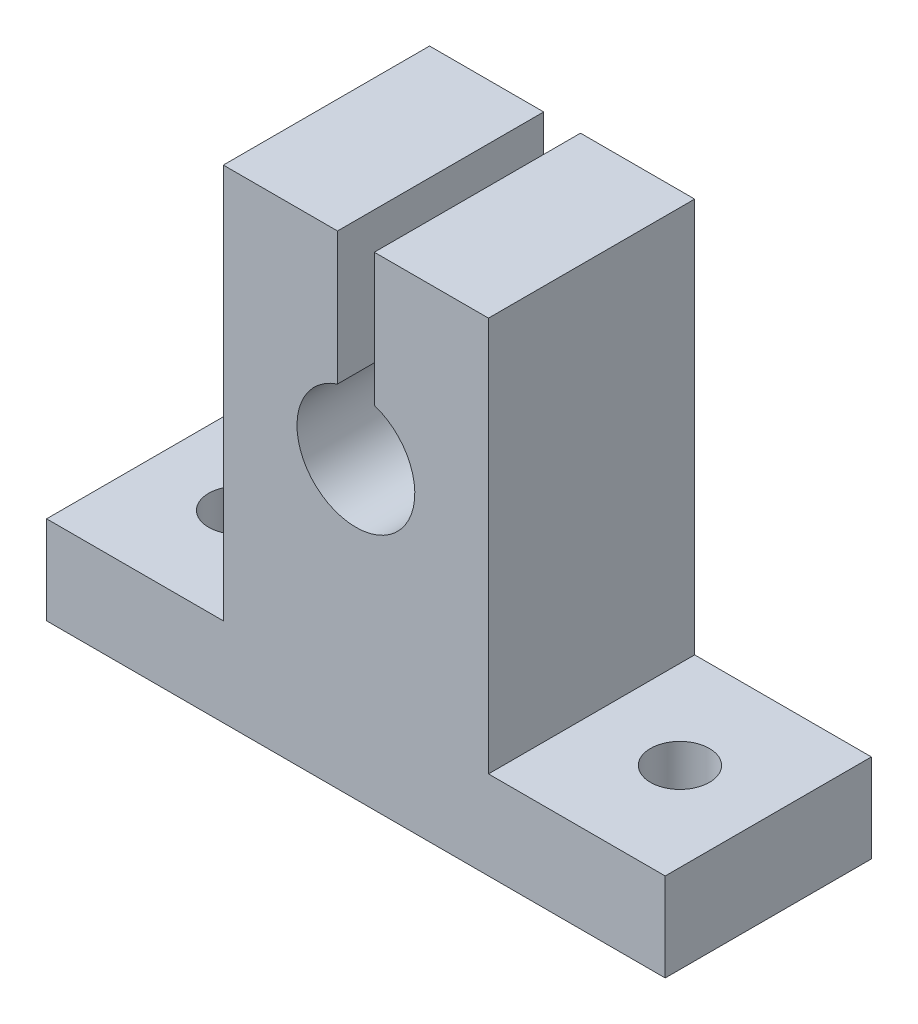
ISO-10303-21;
HEADER;
FILE_DESCRIPTION(('STEP AP214'),'2;1');
FILE_NAME('part.step','',(''),(''),'','','');
FILE_SCHEMA(('AUTOMOTIVE_DESIGN { 1 0 10303 214 1 1 1 1 }'));
ENDSEC;
DATA;
#1=APPLICATION_CONTEXT('core data for automotive mechanical design processes');
#2=APPLICATION_PROTOCOL_DEFINITION('international standard','automotive_design',2000,#1);
#3=PRODUCT_CONTEXT('',#1,'mechanical');
#4=PRODUCT('Part','Part','',(#3));
#5=PRODUCT_RELATED_PRODUCT_CATEGORY('part','',(#4));
#6=PRODUCT_DEFINITION_FORMATION('','',#4);
#7=PRODUCT_DEFINITION_CONTEXT('part definition',#1,'design');
#8=PRODUCT_DEFINITION('design','',#6,#7);
#9=PRODUCT_DEFINITION_SHAPE('','',#8);
#10=(LENGTH_UNIT() NAMED_UNIT(*) SI_UNIT(.MILLI.,.METRE.));
#11=(NAMED_UNIT(*) PLANE_ANGLE_UNIT() SI_UNIT($,.RADIAN.));
#12=(NAMED_UNIT(*) SI_UNIT($,.STERADIAN.) SOLID_ANGLE_UNIT());
#13=UNCERTAINTY_MEASURE_WITH_UNIT(LENGTH_MEASURE(1.E-05),#10,'distance_accuracy_value','');
#14=(GEOMETRIC_REPRESENTATION_CONTEXT(3) GLOBAL_UNCERTAINTY_ASSIGNED_CONTEXT((#13)) GLOBAL_UNIT_ASSIGNED_CONTEXT((#10,
#11,#12)) REPRESENTATION_CONTEXT('',''));
#15=CARTESIAN_POINT('',(0.,0.,0.));
#16=DIRECTION('',(0.,0.,1.));
#17=DIRECTION('',(1.,0.,0.));
#18=AXIS2_PLACEMENT_3D('',#15,#16,#17);
#19=CARTESIAN_POINT('',(0.,6.00000000000001,14.));
#20=DIRECTION('',(1.,0.,0.));
#21=DIRECTION('',(0.,1.,0.));
#22=AXIS2_PLACEMENT_3D('',#19,#20,#21);
#23=PLANE('',#22);
#24=DIRECTION('',(0.,-1.,0.));
#25=VECTOR('',#24,1.);
#26=CARTESIAN_POINT('',(0.,6.00000000000001,0.));
#27=LINE('',#26,#25);
#28=CARTESIAN_POINT('',(0.,6.00000000000001,0.));
#29=VERTEX_POINT('',#28);
#30=CARTESIAN_POINT('',(0.,0.,0.));
#31=VERTEX_POINT('',#30);
#32=EDGE_CURVE('E166',#29,#31,#27,.T.);
#33=ORIENTED_EDGE('',*,*,#32,.T.);
#34=DIRECTION('',(0.,0.,-1.));
#35=VECTOR('',#34,1.);
#36=CARTESIAN_POINT('',(0.,0.,14.));
#37=LINE('',#36,#35);
#38=CARTESIAN_POINT('',(0.,0.,14.));
#39=VERTEX_POINT('',#38);
#40=EDGE_CURVE('E11',#39,#31,#37,.T.);
#41=ORIENTED_EDGE('',*,*,#40,.F.);
#42=DIRECTION('',(0.,-1.,0.));
#43=VECTOR('',#42,1.);
#44=CARTESIAN_POINT('',(0.,6.00000000000001,14.));
#45=LINE('',#44,#43);
#46=CARTESIAN_POINT('',(0.,6.00000000000001,14.));
#47=VERTEX_POINT('',#46);
#48=EDGE_CURVE('E201',#47,#39,#45,.T.);
#49=ORIENTED_EDGE('',*,*,#48,.F.);
#50=DIRECTION('',(0.,0.,-1.));
#51=VECTOR('',#50,1.);
#52=CARTESIAN_POINT('',(0.,6.00000000000001,14.));
#53=LINE('',#52,#51);
#54=EDGE_CURVE('E162',#47,#29,#53,.T.);
#55=ORIENTED_EDGE('',*,*,#54,.T.);
#56=EDGE_LOOP('',(#33,#41,#49,#55));
#57=FACE_BOUND('',#56,.T.);
#58=ADVANCED_FACE('F40',(#57),#23,.F.);
#59=CARTESIAN_POINT('',(0.,0.,14.));
#60=DIRECTION('',(0.,1.,0.));
#61=DIRECTION('',(0.,0.,1.));
#62=AXIS2_PLACEMENT_3D('',#59,#60,#61);
#63=PLANE('',#62);
#64=CARTESIAN_POINT('',(6.00000000000001,0.,7.00000000000001));
#65=DIRECTION('',(0.,1.,0.));
#66=DIRECTION('',(-1.,0.,0.));
#67=AXIS2_PLACEMENT_3D('',#64,#65,#66);
#68=CIRCLE('',#67,2.);
#69=CARTESIAN_POINT('',(4.00000000000001,0.,7.00000000000001));
#70=VERTEX_POINT('',#69);
#71=EDGE_CURVE('E171',#70,#70,#68,.T.);
#72=ORIENTED_EDGE('',*,*,#71,.T.);
#73=EDGE_LOOP('',(#72));
#74=FACE_BOUND('',#73,.T.);
#75=CARTESIAN_POINT('',(36.,0.,7.00000000000001));
#76=DIRECTION('',(0.,1.,0.));
#77=DIRECTION('',(-1.,0.,0.));
#78=AXIS2_PLACEMENT_3D('',#75,#76,#77);
#79=CIRCLE('',#78,2.);
#80=CARTESIAN_POINT('',(34.,0.,7.00000000000001));
#81=VERTEX_POINT('',#80);
#82=EDGE_CURVE('E386',#81,#81,#79,.T.);
#83=ORIENTED_EDGE('',*,*,#82,.T.);
#84=EDGE_LOOP('',(#83));
#85=FACE_BOUND('',#84,.T.);
#86=DIRECTION('',(1.,0.,0.));
#87=VECTOR('',#86,1.);
#88=CARTESIAN_POINT('',(0.,0.,0.));
#89=LINE('',#88,#87);
#90=CARTESIAN_POINT('',(42.,0.,0.));
#91=VERTEX_POINT('',#90);
#92=EDGE_CURVE('E170',#31,#91,#89,.T.);
#93=ORIENTED_EDGE('',*,*,#92,.T.);
#94=DIRECTION('',(0.,0.,-1.));
#95=VECTOR('',#94,1.);
#96=CARTESIAN_POINT('',(42.,0.,14.));
#97=LINE('',#96,#95);
#98=CARTESIAN_POINT('',(42.,0.,14.));
#99=VERTEX_POINT('',#98);
#100=EDGE_CURVE('E49',#99,#91,#97,.T.);
#101=ORIENTED_EDGE('',*,*,#100,.F.);
#102=DIRECTION('',(1.,0.,0.));
#103=VECTOR('',#102,1.);
#104=CARTESIAN_POINT('',(0.,0.,14.));
#105=LINE('',#104,#103);
#106=EDGE_CURVE('E112',#39,#99,#105,.T.);
#107=ORIENTED_EDGE('',*,*,#106,.F.);
#108=ORIENTED_EDGE('',*,*,#40,.T.);
#109=EDGE_LOOP('',(#93,#101,#107,#108));
#110=FACE_BOUND('',#109,.T.);
#111=ADVANCED_FACE('F304',(#74,#85,#110),#63,.F.);
#112=CARTESIAN_POINT('',(42.,0.,14.));
#113=DIRECTION('',(-1.,0.,0.));
#114=DIRECTION('',(0.,0.,1.));
#115=AXIS2_PLACEMENT_3D('',#112,#113,#114);
#116=PLANE('',#115);
#117=DIRECTION('',(0.,1.,0.));
#118=VECTOR('',#117,1.);
#119=CARTESIAN_POINT('',(42.,0.,0.));
#120=LINE('',#119,#118);
#121=CARTESIAN_POINT('',(42.,6.00000000000001,0.));
#122=VERTEX_POINT('',#121);
#123=EDGE_CURVE('E174',#91,#122,#120,.T.);
#124=ORIENTED_EDGE('',*,*,#123,.T.);
#125=DIRECTION('',(0.,0.,-1.));
#126=VECTOR('',#125,1.);
#127=CARTESIAN_POINT('',(42.,6.00000000000001,14.));
#128=LINE('',#127,#126);
#129=CARTESIAN_POINT('',(42.,6.00000000000001,14.));
#130=VERTEX_POINT('',#129);
#131=EDGE_CURVE('E228',#130,#122,#128,.T.);
#132=ORIENTED_EDGE('',*,*,#131,.F.);
#133=DIRECTION('',(0.,1.,0.));
#134=VECTOR('',#133,1.);
#135=CARTESIAN_POINT('',(42.,0.,14.));
#136=LINE('',#135,#134);
#137=EDGE_CURVE('E239',#99,#130,#136,.T.);
#138=ORIENTED_EDGE('',*,*,#137,.F.);
#139=ORIENTED_EDGE('',*,*,#100,.T.);
#140=EDGE_LOOP('',(#124,#132,#138,#139));
#141=FACE_BOUND('',#140,.T.);
#142=ADVANCED_FACE('F237',(#141),#116,.F.);
#143=CARTESIAN_POINT('',(42.,6.00000000000001,14.));
#144=DIRECTION('',(0.,-1.,0.));
#145=DIRECTION('',(1.,0.,0.));
#146=AXIS2_PLACEMENT_3D('',#143,#144,#145);
#147=PLANE('',#146);
#148=CARTESIAN_POINT('',(36.,6.00000000000001,7.00000000000001));
#149=DIRECTION('',(0.,1.,0.));
#150=DIRECTION('',(-1.,0.,0.));
#151=AXIS2_PLACEMENT_3D('',#148,#149,#150);
#152=CIRCLE('',#151,2.);
#153=CARTESIAN_POINT('',(34.,6.00000000000001,7.00000000000001));
#154=VERTEX_POINT('',#153);
#155=EDGE_CURVE('E389',#154,#154,#152,.T.);
#156=ORIENTED_EDGE('',*,*,#155,.F.);
#157=EDGE_LOOP('',(#156));
#158=FACE_BOUND('',#157,.T.);
#159=DIRECTION('',(-1.,0.,0.));
#160=VECTOR('',#159,1.);
#161=CARTESIAN_POINT('',(42.,6.00000000000001,0.));
#162=LINE('',#161,#160);
#163=CARTESIAN_POINT('',(30.,6.00000000000001,0.));
#164=VERTEX_POINT('',#163);
#165=EDGE_CURVE('E177',#122,#164,#162,.T.);
#166=ORIENTED_EDGE('',*,*,#165,.T.);
#167=DIRECTION('',(0.,0.,-1.));
#168=VECTOR('',#167,1.);
#169=CARTESIAN_POINT('',(30.,6.00000000000001,14.));
#170=LINE('',#169,#168);
#171=CARTESIAN_POINT('',(30.,6.00000000000001,14.));
#172=VERTEX_POINT('',#171);
#173=EDGE_CURVE('E224',#172,#164,#170,.T.);
#174=ORIENTED_EDGE('',*,*,#173,.F.);
#175=DIRECTION('',(-1.,0.,0.));
#176=VECTOR('',#175,1.);
#177=CARTESIAN_POINT('',(42.,6.00000000000001,14.));
#178=LINE('',#177,#176);
#179=EDGE_CURVE('E258',#130,#172,#178,.T.);
#180=ORIENTED_EDGE('',*,*,#179,.F.);
#181=ORIENTED_EDGE('',*,*,#131,.T.);
#182=EDGE_LOOP('',(#166,#174,#180,#181));
#183=FACE_BOUND('',#182,.T.);
#184=ADVANCED_FACE('F248',(#158,#183),#147,.F.);
#185=CARTESIAN_POINT('',(30.,6.00000000000001,14.));
#186=DIRECTION('',(-1.,0.,0.));
#187=DIRECTION('',(0.,0.,1.));
#188=AXIS2_PLACEMENT_3D('',#185,#186,#187);
#189=PLANE('',#188);
#190=DIRECTION('',(0.,1.,0.));
#191=VECTOR('',#190,1.);
#192=CARTESIAN_POINT('',(30.,6.00000000000001,0.));
#193=LINE('',#192,#191);
#194=CARTESIAN_POINT('',(30.,32.8,0.));
#195=VERTEX_POINT('',#194);
#196=EDGE_CURVE('E180',#164,#195,#193,.T.);
#197=ORIENTED_EDGE('',*,*,#196,.T.);
#198=DIRECTION('',(0.,0.,-1.));
#199=VECTOR('',#198,1.);
#200=CARTESIAN_POINT('',(30.,32.8,14.));
#201=LINE('',#200,#199);
#202=CARTESIAN_POINT('',(30.,32.8,14.));
#203=VERTEX_POINT('',#202);
#204=EDGE_CURVE('E220',#203,#195,#201,.T.);
#205=ORIENTED_EDGE('',*,*,#204,.F.);
#206=DIRECTION('',(0.,1.,0.));
#207=VECTOR('',#206,1.);
#208=CARTESIAN_POINT('',(30.,6.00000000000001,14.));
#209=LINE('',#208,#207);
#210=EDGE_CURVE('E254',#172,#203,#209,.T.);
#211=ORIENTED_EDGE('',*,*,#210,.F.);
#212=ORIENTED_EDGE('',*,*,#173,.T.);
#213=EDGE_LOOP('',(#197,#205,#211,#212));
#214=FACE_BOUND('',#213,.T.);
#215=ADVANCED_FACE('F252',(#214),#189,.F.);
#216=CARTESIAN_POINT('',(30.,32.8,14.));
#217=DIRECTION('',(0.,-1.,0.));
#218=DIRECTION('',(1.,0.,0.));
#219=AXIS2_PLACEMENT_3D('',#216,#217,#218);
#220=PLANE('',#219);
#221=DIRECTION('',(-1.,0.,0.));
#222=VECTOR('',#221,1.);
#223=CARTESIAN_POINT('',(30.,32.8,0.));
#224=LINE('',#223,#222);
#225=CARTESIAN_POINT('',(22.2490078819241,32.8,0.));
#226=VERTEX_POINT('',#225);
#227=EDGE_CURVE('E183',#195,#226,#224,.T.);
#228=ORIENTED_EDGE('',*,*,#227,.T.);
#229=DIRECTION('',(0.,0.,-1.));
#230=VECTOR('',#229,1.);
#231=CARTESIAN_POINT('',(22.2490078819241,32.8,14.));
#232=LINE('',#231,#230);
#233=CARTESIAN_POINT('',(22.2490078819241,32.8,14.));
#234=VERTEX_POINT('',#233);
#235=EDGE_CURVE('E216',#234,#226,#232,.T.);
#236=ORIENTED_EDGE('',*,*,#235,.F.);
#237=DIRECTION('',(-1.,0.,0.));
#238=VECTOR('',#237,1.);
#239=CARTESIAN_POINT('',(30.,32.8,14.));
#240=LINE('',#239,#238);
#241=EDGE_CURVE('E257',#203,#234,#240,.T.);
#242=ORIENTED_EDGE('',*,*,#241,.F.);
#243=ORIENTED_EDGE('',*,*,#204,.T.);
#244=EDGE_LOOP('',(#228,#236,#242,#243));
#245=FACE_BOUND('',#244,.T.);
#246=ADVANCED_FACE('F321',(#245),#220,.F.);
#247=CARTESIAN_POINT('',(22.2490078819241,32.8,14.));
#248=DIRECTION('',(1.,0.,0.));
#249=DIRECTION('',(0.,0.,-1.));
#250=AXIS2_PLACEMENT_3D('',#247,#248,#249);
#251=PLANE('',#250);
#252=DIRECTION('',(0.,-1.,0.));
#253=VECTOR('',#252,1.);
#254=CARTESIAN_POINT('',(22.2490078819241,32.8,0.));
#255=LINE('',#254,#253);
#256=CARTESIAN_POINT('',(22.2490078819241,23.8,0.));
#257=VERTEX_POINT('',#256);
#258=EDGE_CURVE('E186',#226,#257,#255,.T.);
#259=ORIENTED_EDGE('',*,*,#258,.T.);
#260=DIRECTION('',(0.,0.,-1.));
#261=VECTOR('',#260,1.);
#262=CARTESIAN_POINT('',(22.2490078819241,23.8,14.));
#263=LINE('',#262,#261);
#264=CARTESIAN_POINT('',(22.2490078819241,23.8,14.));
#265=VERTEX_POINT('',#264);
#266=EDGE_CURVE('E212',#265,#257,#263,.T.);
#267=ORIENTED_EDGE('',*,*,#266,.F.);
#268=DIRECTION('',(0.,-1.,0.));
#269=VECTOR('',#268,1.);
#270=CARTESIAN_POINT('',(22.2490078819241,32.8,14.));
#271=LINE('',#270,#269);
#272=EDGE_CURVE('E263',#234,#265,#271,.T.);
#273=ORIENTED_EDGE('',*,*,#272,.F.);
#274=ORIENTED_EDGE('',*,*,#235,.T.);
#275=EDGE_LOOP('',(#259,#267,#273,#274));
#276=FACE_BOUND('',#275,.T.);
#277=ADVANCED_FACE('F324',(#276),#251,.F.);
#278=CARTESIAN_POINT('',(21.,20.,14.));
#279=DIRECTION('',(0.,0.,-1.));
#280=DIRECTION('',(-1.,0.,0.));
#281=AXIS2_PLACEMENT_3D('',#278,#279,#280);
#282=CYLINDRICAL_SURFACE('',#281,4.00000258613773);
#283=CARTESIAN_POINT('',(21.,20.,0.));
#284=DIRECTION('',(0.,0.,-1.));
#285=DIRECTION('',(1.,0.,0.));
#286=AXIS2_PLACEMENT_3D('',#283,#284,#285);
#287=CIRCLE('',#286,4.00000258613773);
#288=CARTESIAN_POINT('',(19.7509921180759,23.8,0.));
#289=VERTEX_POINT('',#288);
#290=EDGE_CURVE('E189',#257,#289,#287,.T.);
#291=ORIENTED_EDGE('',*,*,#290,.T.);
#292=DIRECTION('',(0.,0.,-1.));
#293=VECTOR('',#292,1.);
#294=CARTESIAN_POINT('',(19.7509921180759,23.8,14.));
#295=LINE('',#294,#293);
#296=CARTESIAN_POINT('',(19.7509921180759,23.8,14.));
#297=VERTEX_POINT('',#296);
#298=EDGE_CURVE('E208',#297,#289,#295,.T.);
#299=ORIENTED_EDGE('',*,*,#298,.F.);
#300=CARTESIAN_POINT('',(21.,20.,14.));
#301=DIRECTION('',(0.,0.,-1.));
#302=DIRECTION('',(1.,0.,0.));
#303=AXIS2_PLACEMENT_3D('',#300,#301,#302);
#304=CIRCLE('',#303,4.00000258613773);
#305=EDGE_CURVE('E270',#265,#297,#304,.T.);
#306=ORIENTED_EDGE('',*,*,#305,.F.);
#307=ORIENTED_EDGE('',*,*,#266,.T.);
#308=EDGE_LOOP('',(#291,#299,#306,#307));
#309=FACE_BOUND('',#308,.T.);
#310=ADVANCED_FACE('F283',(#309),#282,.F.);
#311=CARTESIAN_POINT('',(19.7509921180759,32.8,14.));
#312=DIRECTION('',(-1.,0.,0.));
#313=DIRECTION('',(0.,0.,1.));
#314=AXIS2_PLACEMENT_3D('',#311,#312,#313);
#315=PLANE('',#314);
#316=DIRECTION('',(0.,1.,0.));
#317=VECTOR('',#316,1.);
#318=CARTESIAN_POINT('',(19.7509921180759,32.8,0.));
#319=LINE('',#318,#317);
#320=CARTESIAN_POINT('',(19.7509921180759,32.8,0.));
#321=VERTEX_POINT('',#320);
#322=EDGE_CURVE('E192',#289,#321,#319,.T.);
#323=ORIENTED_EDGE('',*,*,#322,.T.);
#324=DIRECTION('',(0.,0.,-1.));
#325=VECTOR('',#324,1.);
#326=CARTESIAN_POINT('',(19.7509921180759,32.8,14.));
#327=LINE('',#326,#325);
#328=CARTESIAN_POINT('',(19.7509921180759,32.8,14.));
#329=VERTEX_POINT('',#328);
#330=EDGE_CURVE('E154',#329,#321,#327,.T.);
#331=ORIENTED_EDGE('',*,*,#330,.F.);
#332=DIRECTION('',(0.,1.,0.));
#333=VECTOR('',#332,1.);
#334=CARTESIAN_POINT('',(19.7509921180759,32.8,14.));
#335=LINE('',#334,#333);
#336=EDGE_CURVE('E143',#297,#329,#335,.T.);
#337=ORIENTED_EDGE('',*,*,#336,.F.);
#338=ORIENTED_EDGE('',*,*,#298,.T.);
#339=EDGE_LOOP('',(#323,#331,#337,#338));
#340=FACE_BOUND('',#339,.T.);
#341=ADVANCED_FACE('F287',(#340),#315,.F.);
#342=CARTESIAN_POINT('',(19.7509921180759,32.8,14.));
#343=DIRECTION('',(0.,-1.,0.));
#344=DIRECTION('',(1.,0.,0.));
#345=AXIS2_PLACEMENT_3D('',#342,#343,#344);
#346=PLANE('',#345);
#347=DIRECTION('',(-1.,0.,0.));
#348=VECTOR('',#347,1.);
#349=CARTESIAN_POINT('',(19.7509921180759,32.8,0.));
#350=LINE('',#349,#348);
#351=CARTESIAN_POINT('',(12.,32.8,0.));
#352=VERTEX_POINT('',#351);
#353=EDGE_CURVE('E152',#321,#352,#350,.T.);
#354=ORIENTED_EDGE('',*,*,#353,.T.);
#355=DIRECTION('',(0.,0.,-1.));
#356=VECTOR('',#355,1.);
#357=CARTESIAN_POINT('',(12.,32.8,14.));
#358=LINE('',#357,#356);
#359=CARTESIAN_POINT('',(12.,32.8,14.));
#360=VERTEX_POINT('',#359);
#361=EDGE_CURVE('E149',#360,#352,#358,.T.);
#362=ORIENTED_EDGE('',*,*,#361,.F.);
#363=DIRECTION('',(-1.,0.,0.));
#364=VECTOR('',#363,1.);
#365=CARTESIAN_POINT('',(19.7509921180759,32.8,14.));
#366=LINE('',#365,#364);
#367=EDGE_CURVE('E137',#329,#360,#366,.T.);
#368=ORIENTED_EDGE('',*,*,#367,.F.);
#369=ORIENTED_EDGE('',*,*,#330,.T.);
#370=EDGE_LOOP('',(#354,#362,#368,#369));
#371=FACE_BOUND('',#370,.T.);
#372=ADVANCED_FACE('F150',(#371),#346,.F.);
#373=CARTESIAN_POINT('',(12.,32.8,14.));
#374=DIRECTION('',(1.,0.,0.));
#375=DIRECTION('',(0.,0.,-1.));
#376=AXIS2_PLACEMENT_3D('',#373,#374,#375);
#377=PLANE('',#376);
#378=DIRECTION('',(0.,-1.,0.));
#379=VECTOR('',#378,1.);
#380=CARTESIAN_POINT('',(12.,32.8,0.));
#381=LINE('',#380,#379);
#382=CARTESIAN_POINT('',(12.,6.00000000000001,0.));
#383=VERTEX_POINT('',#382);
#384=EDGE_CURVE('E98',#352,#383,#381,.T.);
#385=ORIENTED_EDGE('',*,*,#384,.T.);
#386=DIRECTION('',(0.,0.,-1.));
#387=VECTOR('',#386,1.);
#388=CARTESIAN_POINT('',(12.,6.00000000000001,14.));
#389=LINE('',#388,#387);
#390=CARTESIAN_POINT('',(12.,6.00000000000001,14.));
#391=VERTEX_POINT('',#390);
#392=EDGE_CURVE('E155',#391,#383,#389,.T.);
#393=ORIENTED_EDGE('',*,*,#392,.F.);
#394=DIRECTION('',(0.,-1.,0.));
#395=VECTOR('',#394,1.);
#396=CARTESIAN_POINT('',(12.,32.8,14.));
#397=LINE('',#396,#395);
#398=EDGE_CURVE('E141',#360,#391,#397,.T.);
#399=ORIENTED_EDGE('',*,*,#398,.F.);
#400=ORIENTED_EDGE('',*,*,#361,.T.);
#401=EDGE_LOOP('',(#385,#393,#399,#400));
#402=FACE_BOUND('',#401,.T.);
#403=ADVANCED_FACE('F157',(#402),#377,.F.);
#404=CARTESIAN_POINT('',(12.,6.00000000000001,14.));
#405=DIRECTION('',(0.,-1.,0.));
#406=DIRECTION('',(1.,0.,0.));
#407=AXIS2_PLACEMENT_3D('',#404,#405,#406);
#408=PLANE('',#407);
#409=CARTESIAN_POINT('',(6.00000000000001,6.00000000000001,7.00000000000001));
#410=DIRECTION('',(0.,1.,0.));
#411=DIRECTION('',(-1.,0.,0.));
#412=AXIS2_PLACEMENT_3D('',#409,#410,#411);
#413=CIRCLE('',#412,2.);
#414=CARTESIAN_POINT('',(4.,6.00000000000001,7.00000000000001));
#415=VERTEX_POINT('',#414);
#416=EDGE_CURVE('E394',#415,#415,#413,.T.);
#417=ORIENTED_EDGE('',*,*,#416,.F.);
#418=EDGE_LOOP('',(#417));
#419=FACE_BOUND('',#418,.T.);
#420=DIRECTION('',(-1.,0.,0.));
#421=VECTOR('',#420,1.);
#422=CARTESIAN_POINT('',(12.,6.00000000000001,0.));
#423=LINE('',#422,#421);
#424=EDGE_CURVE('E104',#383,#29,#423,.T.);
#425=ORIENTED_EDGE('',*,*,#424,.T.);
#426=ORIENTED_EDGE('',*,*,#54,.F.);
#427=DIRECTION('',(-1.,0.,0.));
#428=VECTOR('',#427,1.);
#429=CARTESIAN_POINT('',(12.,6.00000000000001,14.));
#430=LINE('',#429,#428);
#431=EDGE_CURVE('E57',#391,#47,#430,.T.);
#432=ORIENTED_EDGE('',*,*,#431,.F.);
#433=ORIENTED_EDGE('',*,*,#392,.T.);
#434=EDGE_LOOP('',(#425,#426,#432,#433));
#435=FACE_BOUND('',#434,.T.);
#436=ADVANCED_FACE('F291',(#419,#435),#408,.F.);
#437=CARTESIAN_POINT('',(21.,20.,14.));
#438=DIRECTION('',(0.,0.,1.));
#439=DIRECTION('',(1.,0.,0.));
#440=AXIS2_PLACEMENT_3D('',#437,#438,#439);
#441=PLANE('',#440);
#442=ORIENTED_EDGE('',*,*,#48,.T.);
#443=ORIENTED_EDGE('',*,*,#106,.T.);
#444=ORIENTED_EDGE('',*,*,#137,.T.);
#445=ORIENTED_EDGE('',*,*,#179,.T.);
#446=ORIENTED_EDGE('',*,*,#210,.T.);
#447=ORIENTED_EDGE('',*,*,#241,.T.);
#448=ORIENTED_EDGE('',*,*,#272,.T.);
#449=ORIENTED_EDGE('',*,*,#305,.T.);
#450=ORIENTED_EDGE('',*,*,#336,.T.);
#451=ORIENTED_EDGE('',*,*,#367,.T.);
#452=ORIENTED_EDGE('',*,*,#398,.T.);
#453=ORIENTED_EDGE('',*,*,#431,.T.);
#454=EDGE_LOOP('',(#442,#443,#444,#445,#446,#447,#448,#449,#450,#451,#452,#453));
#455=FACE_BOUND('',#454,.T.);
#456=ADVANCED_FACE('F139',(#455),#441,.T.);
#457=CARTESIAN_POINT('',(21.,20.,0.));
#458=DIRECTION('',(0.,0.,1.));
#459=DIRECTION('',(1.,0.,0.));
#460=AXIS2_PLACEMENT_3D('',#457,#458,#459);
#461=PLANE('',#460);
#462=ORIENTED_EDGE('',*,*,#32,.F.);
#463=ORIENTED_EDGE('',*,*,#424,.F.);
#464=ORIENTED_EDGE('',*,*,#384,.F.);
#465=ORIENTED_EDGE('',*,*,#353,.F.);
#466=ORIENTED_EDGE('',*,*,#322,.F.);
#467=ORIENTED_EDGE('',*,*,#290,.F.);
#468=ORIENTED_EDGE('',*,*,#258,.F.);
#469=ORIENTED_EDGE('',*,*,#227,.F.);
#470=ORIENTED_EDGE('',*,*,#196,.F.);
#471=ORIENTED_EDGE('',*,*,#165,.F.);
#472=ORIENTED_EDGE('',*,*,#123,.F.);
#473=ORIENTED_EDGE('',*,*,#92,.F.);
#474=EDGE_LOOP('',(#462,#463,#464,#465,#466,#467,#468,#469,#470,#471,#472,#473));
#475=FACE_BOUND('',#474,.T.);
#476=ADVANCED_FACE('F243',(#475),#461,.F.);
#477=CARTESIAN_POINT('',(6.00000000000001,0.,7.00000000000001));
#478=DIRECTION('',(0.,1.,0.));
#479=DIRECTION('',(-1.,0.,0.));
#480=AXIS2_PLACEMENT_3D('',#477,#478,#479);
#481=CYLINDRICAL_SURFACE('',#480,2.);
#482=CARTESIAN_POINT('',(4.00000000000001,0.,7.00000000000001));
#483=CARTESIAN_POINT('',(4.00000000000001,0.0624999999999859,7.00000000000001));
#484=CARTESIAN_POINT('',(4.00000000000001,0.124999999999986,7.00000000000001));
#485=CARTESIAN_POINT('',(4.00000000000001,0.249999999999986,7.00000000000001));
#486=CARTESIAN_POINT('',(4.00000000000001,0.312499999999987,7.00000000000001));
#487=CARTESIAN_POINT('',(4.00000000000001,0.437499999999987,7.00000000000001));
#488=CARTESIAN_POINT('',(4.00000000000001,0.499999999999987,7.00000000000001));
#489=CARTESIAN_POINT('',(4.00000000000001,0.624999999999988,7.00000000000001));
#490=CARTESIAN_POINT('',(4.00000000000001,0.687499999999988,7.00000000000001));
#491=CARTESIAN_POINT('',(4.00000000000001,0.812499999999988,7.00000000000001));
#492=CARTESIAN_POINT('',(4.00000000000001,0.874999999999989,7.00000000000001));
#493=CARTESIAN_POINT('',(4.00000000000001,0.999999999999989,7.00000000000001));
#494=CARTESIAN_POINT('',(4.00000000000001,1.06249999999999,7.00000000000001));
#495=CARTESIAN_POINT('',(4.00000000000001,1.18749999999999,7.00000000000001));
#496=CARTESIAN_POINT('',(4.00000000000001,1.24999999999999,7.00000000000001));
#497=CARTESIAN_POINT('',(4.00000000000001,1.37499999999999,7.00000000000001));
#498=CARTESIAN_POINT('',(4.,1.43749999999999,7.00000000000001));
#499=CARTESIAN_POINT('',(4.,1.56249999999999,7.00000000000001));
#500=CARTESIAN_POINT('',(4.,1.62499999999999,7.00000000000001));
#501=CARTESIAN_POINT('',(4.,1.74999999999999,7.00000000000001));
#502=CARTESIAN_POINT('',(4.,1.81249999999999,7.00000000000001));
#503=CARTESIAN_POINT('',(4.,1.93749999999999,7.00000000000001));
#504=CARTESIAN_POINT('',(4.,1.99999999999999,7.00000000000001));
#505=CARTESIAN_POINT('',(4.,2.12499999999999,7.00000000000001));
#506=CARTESIAN_POINT('',(4.,2.18749999999999,7.00000000000001));
#507=CARTESIAN_POINT('',(4.,2.31249999999999,7.00000000000001));
#508=CARTESIAN_POINT('',(4.,2.37499999999999,7.00000000000001));
#509=CARTESIAN_POINT('',(4.,2.49999999999999,7.00000000000001));
#510=CARTESIAN_POINT('',(4.,2.56249999999999,7.00000000000001));
#511=CARTESIAN_POINT('',(4.,2.68749999999999,7.00000000000001));
#512=CARTESIAN_POINT('',(4.,2.75,7.00000000000001));
#513=CARTESIAN_POINT('',(4.,2.875,7.00000000000001));
#514=CARTESIAN_POINT('',(4.,2.9375,7.00000000000001));
#515=CARTESIAN_POINT('',(4.,3.0625,7.00000000000001));
#516=CARTESIAN_POINT('',(4.,3.125,7.00000000000001));
#517=CARTESIAN_POINT('',(4.,3.25,7.00000000000001));
#518=CARTESIAN_POINT('',(4.,3.3125,7.00000000000001));
#519=CARTESIAN_POINT('',(4.,3.4375,7.00000000000001));
#520=CARTESIAN_POINT('',(4.,3.5,7.00000000000001));
#521=CARTESIAN_POINT('',(4.,3.625,7.00000000000001));
#522=CARTESIAN_POINT('',(4.,3.6875,7.00000000000001));
#523=CARTESIAN_POINT('',(4.,3.8125,7.00000000000001));
#524=CARTESIAN_POINT('',(4.,3.875,7.00000000000001));
#525=CARTESIAN_POINT('',(4.,4.,7.00000000000001));
#526=CARTESIAN_POINT('',(4.,4.0625,7.00000000000001));
#527=CARTESIAN_POINT('',(4.,4.1875,7.00000000000001));
#528=CARTESIAN_POINT('',(4.,4.25,7.00000000000001));
#529=CARTESIAN_POINT('',(4.,4.375,7.00000000000001));
#530=CARTESIAN_POINT('',(4.,4.4375,7.00000000000001));
#531=CARTESIAN_POINT('',(4.,4.5625,7.00000000000001));
#532=CARTESIAN_POINT('',(4.,4.625,7.00000000000001));
#533=CARTESIAN_POINT('',(4.,4.75,7.00000000000001));
#534=CARTESIAN_POINT('',(4.,4.8125,7.00000000000001));
#535=CARTESIAN_POINT('',(4.,4.9375,7.00000000000001));
#536=CARTESIAN_POINT('',(4.,5.,7.00000000000001));
#537=CARTESIAN_POINT('',(4.,5.125,7.00000000000001));
#538=CARTESIAN_POINT('',(4.,5.1875,7.00000000000001));
#539=CARTESIAN_POINT('',(4.,5.3125,7.00000000000001));
#540=CARTESIAN_POINT('',(4.,5.375,7.00000000000001));
#541=CARTESIAN_POINT('',(4.,5.5,7.00000000000001));
#542=CARTESIAN_POINT('',(4.,5.5625,7.00000000000001));
#543=CARTESIAN_POINT('',(4.,5.6875,7.00000000000001));
#544=CARTESIAN_POINT('',(4.,5.75,7.00000000000001));
#545=CARTESIAN_POINT('',(4.,5.875,7.00000000000001));
#546=CARTESIAN_POINT('',(4.,5.93750000000001,7.00000000000001));
#547=CARTESIAN_POINT('',(4.,6.00000000000001,7.00000000000001));
#548=B_SPLINE_CURVE_WITH_KNOTS('',3,(#482,#483,#484,#485,#486,#487,#488,#489,#490,#491,#492,
#493,#494,#495,#496,#497,#498,#499,#500,#501,#502,#503,#504,#505,#506,#507,#508,#509,#510,#511,
#512,#513,#514,#515,#516,#517,#518,#519,#520,#521,#522,#523,#524,#525,#526,#527,#528,#529,#530,
#531,#532,#533,#534,#535,#536,#537,#538,#539,#540,#541,#542,#543,#544,#545,#546,#547),
.UNSPECIFIED.,.F.,.F.,(4,2,2,2,2,2,2,2,2,2,2,2,2,2,2,2,2,2,2,2,2,2,2,2,2,2,2,2,2,2,2,2,4),(0.,
0.187500000000001,0.375000000000001,0.562500000000002,0.750000000000003,0.937500000000003,1.125,
1.3125,1.5,1.68750000000001,1.87500000000001,2.06250000000001,2.25000000000001,2.43750000000001,
2.62500000000001,2.81250000000001,3.00000000000001,3.18750000000001,3.37500000000001,
3.56250000000001,3.75000000000001,3.93750000000001,4.12500000000001,4.31250000000001,
4.50000000000001,4.68750000000001,4.87500000000002,5.06250000000002,5.25000000000002,
5.43750000000002,5.62500000000002,5.81250000000002,6.00000000000002),.UNSPECIFIED.);
#549=EDGE_CURVE('BSEAM361',#70,#415,#548,.T.);
#550=ORIENTED_EDGE('',*,*,#71,.F.);
#551=ORIENTED_EDGE('',*,*,#416,.T.);
#552=ORIENTED_EDGE('',*,*,#549,.T.);
#553=ORIENTED_EDGE('',*,*,#549,.F.);
#554=EDGE_LOOP('',(#550,#552,#551,#553));
#555=FACE_BOUND('',#554,.T.);
#556=ADVANCED_FACE('F361',(#555),#481,.F.);
#557=CARTESIAN_POINT('',(36.,0.,7.00000000000001));
#558=DIRECTION('',(0.,1.,0.));
#559=DIRECTION('',(-1.,0.,0.));
#560=AXIS2_PLACEMENT_3D('',#557,#558,#559);
#561=CYLINDRICAL_SURFACE('',#560,2.);
#562=CARTESIAN_POINT('',(34.,0.,7.00000000000001));
#563=CARTESIAN_POINT('',(34.,0.0624999999999995,7.00000000000001));
#564=CARTESIAN_POINT('',(34.,0.125,7.00000000000001));
#565=CARTESIAN_POINT('',(34.,0.25,7.00000000000001));
#566=CARTESIAN_POINT('',(34.,0.3125,7.00000000000001));
#567=CARTESIAN_POINT('',(34.,0.4375,7.00000000000001));
#568=CARTESIAN_POINT('',(34.,0.5,7.00000000000001));
#569=CARTESIAN_POINT('',(34.,0.625,7.00000000000001));
#570=CARTESIAN_POINT('',(34.,0.6875,7.00000000000001));
#571=CARTESIAN_POINT('',(34.,0.8125,7.00000000000001));
#572=CARTESIAN_POINT('',(34.,0.875,7.00000000000001));
#573=CARTESIAN_POINT('',(34.,1.,7.00000000000001));
#574=CARTESIAN_POINT('',(34.,1.0625,7.00000000000001));
#575=CARTESIAN_POINT('',(34.,1.1875,7.00000000000001));
#576=CARTESIAN_POINT('',(34.,1.25,7.00000000000001));
#577=CARTESIAN_POINT('',(34.,1.375,7.00000000000001));
#578=CARTESIAN_POINT('',(34.,1.4375,7.00000000000001));
#579=CARTESIAN_POINT('',(34.,1.5625,7.00000000000001));
#580=CARTESIAN_POINT('',(34.,1.625,7.00000000000001));
#581=CARTESIAN_POINT('',(34.,1.75,7.00000000000001));
#582=CARTESIAN_POINT('',(34.,1.8125,7.00000000000001));
#583=CARTESIAN_POINT('',(34.,1.9375,7.00000000000001));
#584=CARTESIAN_POINT('',(34.,2.,7.00000000000001));
#585=CARTESIAN_POINT('',(34.,2.125,7.00000000000001));
#586=CARTESIAN_POINT('',(34.,2.1875,7.00000000000001));
#587=CARTESIAN_POINT('',(34.,2.3125,7.00000000000001));
#588=CARTESIAN_POINT('',(34.,2.375,7.00000000000001));
#589=CARTESIAN_POINT('',(34.,2.5,7.00000000000001));
#590=CARTESIAN_POINT('',(34.,2.5625,7.00000000000001));
#591=CARTESIAN_POINT('',(34.,2.6875,7.00000000000001));
#592=CARTESIAN_POINT('',(34.,2.75,7.00000000000001));
#593=CARTESIAN_POINT('',(34.,2.875,7.00000000000001));
#594=CARTESIAN_POINT('',(34.,2.9375,7.00000000000001));
#595=CARTESIAN_POINT('',(34.,3.0625,7.00000000000001));
#596=CARTESIAN_POINT('',(34.,3.125,7.00000000000001));
#597=CARTESIAN_POINT('',(34.,3.25,7.00000000000001));
#598=CARTESIAN_POINT('',(34.,3.3125,7.00000000000001));
#599=CARTESIAN_POINT('',(34.,3.4375,7.00000000000001));
#600=CARTESIAN_POINT('',(34.,3.5,7.00000000000001));
#601=CARTESIAN_POINT('',(34.,3.625,7.00000000000001));
#602=CARTESIAN_POINT('',(34.,3.6875,7.00000000000001));
#603=CARTESIAN_POINT('',(34.,3.8125,7.00000000000001));
#604=CARTESIAN_POINT('',(34.,3.875,7.00000000000001));
#605=CARTESIAN_POINT('',(34.,4.,7.00000000000001));
#606=CARTESIAN_POINT('',(34.,4.0625,7.00000000000001));
#607=CARTESIAN_POINT('',(34.,4.1875,7.00000000000001));
#608=CARTESIAN_POINT('',(34.,4.25,7.00000000000001));
#609=CARTESIAN_POINT('',(34.,4.375,7.00000000000001));
#610=CARTESIAN_POINT('',(34.,4.4375,7.00000000000001));
#611=CARTESIAN_POINT('',(34.,4.5625,7.00000000000001));
#612=CARTESIAN_POINT('',(34.,4.625,7.00000000000001));
#613=CARTESIAN_POINT('',(34.,4.75,7.00000000000001));
#614=CARTESIAN_POINT('',(34.,4.8125,7.00000000000001));
#615=CARTESIAN_POINT('',(34.,4.9375,7.00000000000001));
#616=CARTESIAN_POINT('',(34.,5.,7.00000000000001));
#617=CARTESIAN_POINT('',(34.,5.125,7.00000000000001));
#618=CARTESIAN_POINT('',(34.,5.1875,7.00000000000001));
#619=CARTESIAN_POINT('',(34.,5.3125,7.00000000000001));
#620=CARTESIAN_POINT('',(34.,5.375,7.00000000000001));
#621=CARTESIAN_POINT('',(34.,5.50000000000001,7.00000000000001));
#622=CARTESIAN_POINT('',(34.,5.56250000000001,7.00000000000001));
#623=CARTESIAN_POINT('',(34.,5.68750000000001,7.00000000000001));
#624=CARTESIAN_POINT('',(34.,5.75000000000001,7.00000000000001));
#625=CARTESIAN_POINT('',(34.,5.87500000000001,7.00000000000001));
#626=CARTESIAN_POINT('',(34.,5.93750000000001,7.00000000000001));
#627=CARTESIAN_POINT('',(34.,6.00000000000001,7.00000000000001));
#628=B_SPLINE_CURVE_WITH_KNOTS('',3,(#562,#563,#564,#565,#566,#567,#568,#569,#570,#571,#572,
#573,#574,#575,#576,#577,#578,#579,#580,#581,#582,#583,#584,#585,#586,#587,#588,#589,#590,#591,
#592,#593,#594,#595,#596,#597,#598,#599,#600,#601,#602,#603,#604,#605,#606,#607,#608,#609,#610,
#611,#612,#613,#614,#615,#616,#617,#618,#619,#620,#621,#622,#623,#624,#625,#626,#627),
.UNSPECIFIED.,.F.,.F.,(4,2,2,2,2,2,2,2,2,2,2,2,2,2,2,2,2,2,2,2,2,2,2,2,2,2,2,2,2,2,2,2,4),(0.,
0.1875,0.375,0.562500000000001,0.750000000000001,0.937500000000001,1.125,1.3125,1.5,1.6875,
1.875,2.0625,2.25,2.4375,2.625,2.8125,3.,3.1875,3.375,3.5625,3.75,3.9375,4.125,4.3125,4.5,
4.68750000000001,4.87500000000001,5.06250000000001,5.25000000000001,5.43750000000001,
5.62500000000001,5.81250000000001,6.00000000000001),.UNSPECIFIED.);
#629=EDGE_CURVE('BSEAM369',#81,#154,#628,.T.);
#630=ORIENTED_EDGE('',*,*,#82,.F.);
#631=ORIENTED_EDGE('',*,*,#155,.T.);
#632=ORIENTED_EDGE('',*,*,#629,.T.);
#633=ORIENTED_EDGE('',*,*,#629,.F.);
#634=EDGE_LOOP('',(#630,#632,#631,#633));
#635=FACE_BOUND('',#634,.T.);
#636=ADVANCED_FACE('F369',(#635),#561,.F.);
#637=CLOSED_SHELL('',(#58,#111,#142,#184,#215,#246,#277,#310,#341,#372,#403,#436,#456,#476,#556,#636));
#638=MANIFOLD_SOLID_BREP('B2',#637);
#639=ADVANCED_BREP_SHAPE_REPRESENTATION('',(#18,#638),#14);
#640=SHAPE_DEFINITION_REPRESENTATION(#9,#639);
ENDSEC;
END-ISO-10303-21;
